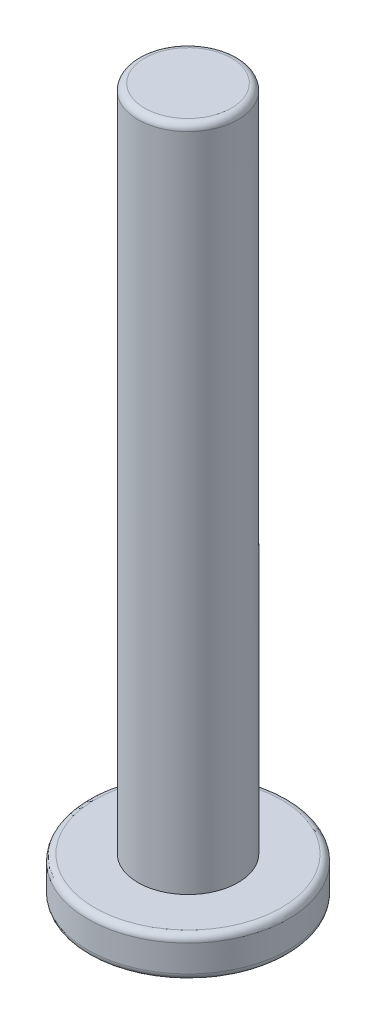
ISO-10303-21;
HEADER;
FILE_DESCRIPTION(('STEP AP214'),'2;1');
FILE_NAME('part.step','',(''),(''),'','','');
FILE_SCHEMA(('AUTOMOTIVE_DESIGN { 1 0 10303 214 1 1 1 1 }'));
ENDSEC;
DATA;
#1=APPLICATION_CONTEXT('core data for automotive mechanical design processes');
#2=APPLICATION_PROTOCOL_DEFINITION('international standard','automotive_design',2000,#1);
#3=PRODUCT_CONTEXT('',#1,'mechanical');
#4=PRODUCT('Part','Part','',(#3));
#5=PRODUCT_RELATED_PRODUCT_CATEGORY('part','',(#4));
#6=PRODUCT_DEFINITION_FORMATION('','',#4);
#7=PRODUCT_DEFINITION_CONTEXT('part definition',#1,'design');
#8=PRODUCT_DEFINITION('design','',#6,#7);
#9=PRODUCT_DEFINITION_SHAPE('','',#8);
#10=(LENGTH_UNIT() NAMED_UNIT(*) SI_UNIT(.MILLI.,.METRE.));
#11=(NAMED_UNIT(*) PLANE_ANGLE_UNIT() SI_UNIT($,.RADIAN.));
#12=(NAMED_UNIT(*) SI_UNIT($,.STERADIAN.) SOLID_ANGLE_UNIT());
#13=UNCERTAINTY_MEASURE_WITH_UNIT(LENGTH_MEASURE(1.E-05),#10,'distance_accuracy_value','');
#14=(GEOMETRIC_REPRESENTATION_CONTEXT(3) GLOBAL_UNCERTAINTY_ASSIGNED_CONTEXT((#13)) GLOBAL_UNIT_ASSIGNED_CONTEXT((#10,
#11,#12)) REPRESENTATION_CONTEXT('',''));
#15=CARTESIAN_POINT('',(0.,0.,0.));
#16=DIRECTION('',(0.,0.,1.));
#17=DIRECTION('',(1.,0.,0.));
#18=AXIS2_PLACEMENT_3D('',#15,#16,#17);
#19=CARTESIAN_POINT('',(0.,0.,0.));
#20=DIRECTION('',(0.,1.,0.));
#21=DIRECTION('',(0.,0.,1.));
#22=AXIS2_PLACEMENT_3D('',#19,#20,#21);
#23=PLANE('',#22);
#24=DIRECTION('',(-0.5,0.,0.866025403784439));
#25=VECTOR('',#24,1.);
#26=CARTESIAN_POINT('',(1.44337567297406,0.,0.));
#27=LINE('',#26,#25);
#28=CARTESIAN_POINT('',(1.44337567297406,0.,0.));
#29=VERTEX_POINT('',#28);
#30=CARTESIAN_POINT('',(0.721687836487032,0.,1.25));
#31=VERTEX_POINT('',#30);
#32=EDGE_CURVE('E122',#29,#31,#27,.T.);
#33=ORIENTED_EDGE('',*,*,#32,.F.);
#34=DIRECTION('',(0.5,0.,0.866025403784439));
#35=VECTOR('',#34,1.);
#36=CARTESIAN_POINT('',(0.721687836487032,0.,-1.25));
#37=LINE('',#36,#35);
#38=CARTESIAN_POINT('',(0.721687836487032,0.,-1.25));
#39=VERTEX_POINT('',#38);
#40=EDGE_CURVE('E48',#39,#29,#37,.T.);
#41=ORIENTED_EDGE('',*,*,#40,.F.);
#42=DIRECTION('',(1.,0.,0.));
#43=VECTOR('',#42,1.);
#44=CARTESIAN_POINT('',(-0.721687836487032,0.,-1.25));
#45=LINE('',#44,#43);
#46=CARTESIAN_POINT('',(-0.721687836487032,0.,-1.25));
#47=VERTEX_POINT('',#46);
#48=EDGE_CURVE('E131',#47,#39,#45,.T.);
#49=ORIENTED_EDGE('',*,*,#48,.F.);
#50=DIRECTION('',(0.5,0.,-0.866025403784439));
#51=VECTOR('',#50,1.);
#52=CARTESIAN_POINT('',(-1.44337567297407,0.,0.));
#53=LINE('',#52,#51);
#54=CARTESIAN_POINT('',(-1.44337567297407,0.,0.));
#55=VERTEX_POINT('',#54);
#56=EDGE_CURVE('E129',#55,#47,#53,.T.);
#57=ORIENTED_EDGE('',*,*,#56,.F.);
#58=DIRECTION('',(-0.5,0.,-0.866025403784439));
#59=VECTOR('',#58,1.);
#60=CARTESIAN_POINT('',(-0.721687836487033,0.,1.25));
#61=LINE('',#60,#59);
#62=CARTESIAN_POINT('',(-0.721687836487033,0.,1.25));
#63=VERTEX_POINT('',#62);
#64=EDGE_CURVE('E96',#63,#55,#61,.T.);
#65=ORIENTED_EDGE('',*,*,#64,.F.);
#66=DIRECTION('',(-1.,0.,0.));
#67=VECTOR('',#66,1.);
#68=CARTESIAN_POINT('',(0.721687836487032,0.,1.25));
#69=LINE('',#68,#67);
#70=EDGE_CURVE('E125',#31,#63,#69,.T.);
#71=ORIENTED_EDGE('',*,*,#70,.F.);
#72=EDGE_LOOP('',(#33,#41,#49,#57,#65,#71));
#73=FACE_BOUND('',#72,.T.);
#74=CARTESIAN_POINT('',(0.,0.,0.));
#75=DIRECTION('',(0.,1.,0.));
#76=DIRECTION('',(0.,0.,1.));
#77=AXIS2_PLACEMENT_3D('',#74,#75,#76);
#78=CIRCLE('',#77,2.8);
#79=CARTESIAN_POINT('',(0.,0.,2.8));
#80=VERTEX_POINT('',#79);
#81=EDGE_CURVE('E11',#80,#80,#78,.F.);
#82=ORIENTED_EDGE('',*,*,#81,.T.);
#83=EDGE_LOOP('',(#82));
#84=FACE_BOUND('',#83,.T.);
#85=ADVANCED_FACE('F33',(#73,#84),#23,.F.);
#86=CARTESIAN_POINT('',(0.,73.1142663620776,0.));
#87=DIRECTION('',(0.,1.,0.));
#88=DIRECTION('',(0.,0.,1.));
#89=AXIS2_PLACEMENT_3D('',#86,#87,#88);
#90=CYLINDRICAL_SURFACE('',#89,3.);
#91=CARTESIAN_POINT('',(0.,1.,0.));
#92=DIRECTION('',(0.,-1.,0.));
#93=DIRECTION('',(0.,0.,-1.));
#94=AXIS2_PLACEMENT_3D('',#91,#92,#93);
#95=CIRCLE('',#94,3.);
#96=CARTESIAN_POINT('',(0.,1.,-3.));
#97=VERTEX_POINT('',#96);
#98=EDGE_CURVE('E149',#97,#97,#95,.T.);
#99=ORIENTED_EDGE('',*,*,#98,.T.);
#100=EDGE_LOOP('',(#99));
#101=FACE_BOUND('',#100,.T.);
#102=CARTESIAN_POINT('',(0.,0.200000000000006,0.));
#103=DIRECTION('',(0.,1.,0.));
#104=DIRECTION('',(0.,0.,1.));
#105=AXIS2_PLACEMENT_3D('',#102,#103,#104);
#106=CIRCLE('',#105,3.);
#107=CARTESIAN_POINT('',(0.,0.200000000000006,3.));
#108=VERTEX_POINT('',#107);
#109=EDGE_CURVE('E146',#108,#108,#106,.T.);
#110=ORIENTED_EDGE('',*,*,#109,.T.);
#111=EDGE_LOOP('',(#110));
#112=FACE_BOUND('',#111,.T.);
#113=ADVANCED_FACE('F179',(#101,#112),#90,.T.);
#114=CARTESIAN_POINT('',(3.,1.2,0.));
#115=DIRECTION('',(0.,-1.,0.));
#116=DIRECTION('',(0.,0.,-1.));
#117=AXIS2_PLACEMENT_3D('',#114,#115,#116);
#118=PLANE('',#117);
#119=CARTESIAN_POINT('',(0.,1.2,0.));
#120=DIRECTION('',(0.,-1.,0.));
#121=DIRECTION('',(0.,0.,-1.));
#122=AXIS2_PLACEMENT_3D('',#119,#120,#121);
#123=CIRCLE('',#122,2.8);
#124=CARTESIAN_POINT('',(0.,1.2,-2.8));
#125=VERTEX_POINT('',#124);
#126=EDGE_CURVE('E143',#125,#125,#123,.F.);
#127=ORIENTED_EDGE('',*,*,#126,.T.);
#128=EDGE_LOOP('',(#127));
#129=FACE_BOUND('',#128,.T.);
#130=CARTESIAN_POINT('',(0.,1.19999999999999,0.));
#131=DIRECTION('',(0.,1.,0.));
#132=DIRECTION('',(0.,0.,1.));
#133=AXIS2_PLACEMENT_3D('',#130,#131,#132);
#134=CIRCLE('',#133,1.5);
#135=CARTESIAN_POINT('',(0.,1.19999999999999,1.5));
#136=VERTEX_POINT('',#135);
#137=EDGE_CURVE('E135',#136,#136,#134,.T.);
#138=ORIENTED_EDGE('',*,*,#137,.F.);
#139=EDGE_LOOP('',(#138));
#140=FACE_BOUND('',#139,.T.);
#141=ADVANCED_FACE('F175',(#129,#140),#118,.F.);
#142=CARTESIAN_POINT('',(0.,73.1142663620776,0.));
#143=DIRECTION('',(0.,1.,0.));
#144=DIRECTION('',(0.,0.,1.));
#145=AXIS2_PLACEMENT_3D('',#142,#143,#144);
#146=CYLINDRICAL_SURFACE('',#145,1.5);
#147=CARTESIAN_POINT('',(0.,21.,0.));
#148=DIRECTION('',(0.,-1.,0.));
#149=DIRECTION('',(0.,0.,-1.));
#150=AXIS2_PLACEMENT_3D('',#147,#148,#149);
#151=CIRCLE('',#150,1.5);
#152=CARTESIAN_POINT('',(0.,21.,-1.5));
#153=VERTEX_POINT('',#152);
#154=EDGE_CURVE('E41',#153,#153,#151,.T.);
#155=ORIENTED_EDGE('',*,*,#154,.T.);
#156=EDGE_LOOP('',(#155));
#157=FACE_BOUND('',#156,.T.);
#158=ORIENTED_EDGE('',*,*,#137,.T.);
#159=EDGE_LOOP('',(#158));
#160=FACE_BOUND('',#159,.T.);
#161=ADVANCED_FACE('F157',(#157,#160),#146,.T.);
#162=CARTESIAN_POINT('',(1.5,21.2,0.));
#163=DIRECTION('',(0.,-1.,0.));
#164=DIRECTION('',(0.,0.,-1.));
#165=AXIS2_PLACEMENT_3D('',#162,#163,#164);
#166=PLANE('',#165);
#167=CARTESIAN_POINT('',(0.,21.2,0.));
#168=DIRECTION('',(0.,-1.,0.));
#169=DIRECTION('',(0.,0.,-1.));
#170=AXIS2_PLACEMENT_3D('',#167,#168,#169);
#171=CIRCLE('',#170,1.3);
#172=CARTESIAN_POINT('',(0.,21.2,-1.3));
#173=VERTEX_POINT('',#172);
#174=EDGE_CURVE('E152',#173,#173,#171,.F.);
#175=ORIENTED_EDGE('',*,*,#174,.T.);
#176=EDGE_LOOP('',(#175));
#177=FACE_BOUND('',#176,.T.);
#178=ADVANCED_FACE('F166',(#177),#166,.F.);
#179=CARTESIAN_POINT('',(0.,1.,0.));
#180=DIRECTION('',(0.,-1.,0.));
#181=DIRECTION('',(0.,0.,-1.));
#182=AXIS2_PLACEMENT_3D('',#179,#180,#181);
#183=TOROIDAL_SURFACE('',#182,2.8,0.2);
#184=ORIENTED_EDGE('',*,*,#98,.F.);
#185=EDGE_LOOP('',(#184));
#186=FACE_BOUND('',#185,.T.);
#187=ORIENTED_EDGE('',*,*,#126,.F.);
#188=EDGE_LOOP('',(#187));
#189=FACE_BOUND('',#188,.T.);
#190=ADVANCED_FACE('F163',(#186,#189),#183,.T.);
#191=CARTESIAN_POINT('',(0.,21.,0.));
#192=DIRECTION('',(0.,-1.,0.));
#193=DIRECTION('',(0.,0.,-1.));
#194=AXIS2_PLACEMENT_3D('',#191,#192,#193);
#195=TOROIDAL_SURFACE('',#194,1.3,0.2);
#196=ORIENTED_EDGE('',*,*,#154,.F.);
#197=EDGE_LOOP('',(#196));
#198=FACE_BOUND('',#197,.T.);
#199=ORIENTED_EDGE('',*,*,#174,.F.);
#200=EDGE_LOOP('',(#199));
#201=FACE_BOUND('',#200,.T.);
#202=ADVANCED_FACE('F160',(#198,#201),#195,.T.);
#203=CARTESIAN_POINT('',(0.,0.200000000000006,0.));
#204=DIRECTION('',(0.,1.,0.));
#205=DIRECTION('',(0.,0.,1.));
#206=AXIS2_PLACEMENT_3D('',#203,#204,#205);
#207=TOROIDAL_SURFACE('',#206,2.8,0.2);
#208=ORIENTED_EDGE('',*,*,#81,.F.);
#209=EDGE_LOOP('',(#208));
#210=FACE_BOUND('',#209,.T.);
#211=ORIENTED_EDGE('',*,*,#109,.F.);
#212=EDGE_LOOP('',(#211));
#213=FACE_BOUND('',#212,.T.);
#214=ADVANCED_FACE('F35',(#210,#213),#207,.T.);
#215=CARTESIAN_POINT('',(0.721687836487032,1.,-1.25));
#216=DIRECTION('',(0.866025403784439,0.,-0.5));
#217=DIRECTION('',(-0.5,0.,-0.866025403784439));
#218=AXIS2_PLACEMENT_3D('',#215,#216,#217);
#219=PLANE('',#218);
#220=ORIENTED_EDGE('',*,*,#40,.T.);
#221=DIRECTION('',(0.,-1.,0.));
#222=VECTOR('',#221,1.);
#223=CARTESIAN_POINT('',(1.44337567297406,1.,0.));
#224=LINE('',#223,#222);
#225=CARTESIAN_POINT('',(1.44337567297406,1.,0.));
#226=VERTEX_POINT('',#225);
#227=EDGE_CURVE('E78',#226,#29,#224,.T.);
#228=ORIENTED_EDGE('',*,*,#227,.F.);
#229=DIRECTION('',(0.5,0.,0.866025403784439));
#230=VECTOR('',#229,1.);
#231=CARTESIAN_POINT('',(0.721687836487032,1.,-1.25));
#232=LINE('',#231,#230);
#233=CARTESIAN_POINT('',(0.721687836487032,1.,-1.25));
#234=VERTEX_POINT('',#233);
#235=EDGE_CURVE('E133',#234,#226,#232,.T.);
#236=ORIENTED_EDGE('',*,*,#235,.F.);
#237=DIRECTION('',(0.,-1.,0.));
#238=VECTOR('',#237,1.);
#239=CARTESIAN_POINT('',(0.721687836487032,1.,-1.25));
#240=LINE('',#239,#238);
#241=EDGE_CURVE('E56',#234,#39,#240,.T.);
#242=ORIENTED_EDGE('',*,*,#241,.T.);
#243=EDGE_LOOP('',(#220,#228,#236,#242));
#244=FACE_BOUND('',#243,.T.);
#245=ADVANCED_FACE('F228',(#244),#219,.F.);
#246=CARTESIAN_POINT('',(-0.721687836487032,1.,-1.25));
#247=DIRECTION('',(0.,0.,-1.));
#248=DIRECTION('',(-1.,0.,0.));
#249=AXIS2_PLACEMENT_3D('',#246,#247,#248);
#250=PLANE('',#249);
#251=ORIENTED_EDGE('',*,*,#48,.T.);
#252=ORIENTED_EDGE('',*,*,#241,.F.);
#253=DIRECTION('',(1.,0.,0.));
#254=VECTOR('',#253,1.);
#255=CARTESIAN_POINT('',(-0.721687836487032,1.,-1.25));
#256=LINE('',#255,#254);
#257=CARTESIAN_POINT('',(-0.721687836487032,1.,-1.25));
#258=VERTEX_POINT('',#257);
#259=EDGE_CURVE('E108',#258,#234,#256,.T.);
#260=ORIENTED_EDGE('',*,*,#259,.F.);
#261=DIRECTION('',(0.,-1.,0.));
#262=VECTOR('',#261,1.);
#263=CARTESIAN_POINT('',(-0.721687836487032,1.,-1.25));
#264=LINE('',#263,#262);
#265=EDGE_CURVE('E100',#258,#47,#264,.T.);
#266=ORIENTED_EDGE('',*,*,#265,.T.);
#267=EDGE_LOOP('',(#251,#252,#260,#266));
#268=FACE_BOUND('',#267,.T.);
#269=ADVANCED_FACE('F243',(#268),#250,.F.);
#270=CARTESIAN_POINT('',(-1.44337567297407,1.,0.));
#271=DIRECTION('',(-0.866025403784439,0.,-0.5));
#272=DIRECTION('',(-0.5,0.,0.866025403784439));
#273=AXIS2_PLACEMENT_3D('',#270,#271,#272);
#274=PLANE('',#273);
#275=ORIENTED_EDGE('',*,*,#56,.T.);
#276=ORIENTED_EDGE('',*,*,#265,.F.);
#277=DIRECTION('',(0.5,0.,-0.866025403784439));
#278=VECTOR('',#277,1.);
#279=CARTESIAN_POINT('',(-1.44337567297407,1.,0.));
#280=LINE('',#279,#278);
#281=CARTESIAN_POINT('',(-1.44337567297407,1.,0.));
#282=VERTEX_POINT('',#281);
#283=EDGE_CURVE('E104',#282,#258,#280,.T.);
#284=ORIENTED_EDGE('',*,*,#283,.F.);
#285=DIRECTION('',(0.,-1.,0.));
#286=VECTOR('',#285,1.);
#287=CARTESIAN_POINT('',(-1.44337567297407,1.,0.));
#288=LINE('',#287,#286);
#289=EDGE_CURVE('E89',#282,#55,#288,.T.);
#290=ORIENTED_EDGE('',*,*,#289,.T.);
#291=EDGE_LOOP('',(#275,#276,#284,#290));
#292=FACE_BOUND('',#291,.T.);
#293=ADVANCED_FACE('F105',(#292),#274,.F.);
#294=CARTESIAN_POINT('',(-0.721687836487033,1.,1.25));
#295=DIRECTION('',(-0.866025403784439,0.,0.5));
#296=DIRECTION('',(0.5,0.,0.866025403784439));
#297=AXIS2_PLACEMENT_3D('',#294,#295,#296);
#298=PLANE('',#297);
#299=ORIENTED_EDGE('',*,*,#64,.T.);
#300=ORIENTED_EDGE('',*,*,#289,.F.);
#301=DIRECTION('',(-0.5,0.,-0.866025403784439));
#302=VECTOR('',#301,1.);
#303=CARTESIAN_POINT('',(-0.721687836487033,1.,1.25));
#304=LINE('',#303,#302);
#305=CARTESIAN_POINT('',(-0.721687836487033,1.,1.25));
#306=VERTEX_POINT('',#305);
#307=EDGE_CURVE('E93',#306,#282,#304,.T.);
#308=ORIENTED_EDGE('',*,*,#307,.F.);
#309=DIRECTION('',(0.,-1.,0.));
#310=VECTOR('',#309,1.);
#311=CARTESIAN_POINT('',(-0.721687836487033,1.,1.25));
#312=LINE('',#311,#310);
#313=EDGE_CURVE('E101',#306,#63,#312,.T.);
#314=ORIENTED_EDGE('',*,*,#313,.T.);
#315=EDGE_LOOP('',(#299,#300,#308,#314));
#316=FACE_BOUND('',#315,.T.);
#317=ADVANCED_FACE('F91',(#316),#298,.F.);
#318=CARTESIAN_POINT('',(0.721687836487032,1.,1.25));
#319=DIRECTION('',(0.,0.,1.));
#320=DIRECTION('',(1.,0.,0.));
#321=AXIS2_PLACEMENT_3D('',#318,#319,#320);
#322=PLANE('',#321);
#323=ORIENTED_EDGE('',*,*,#70,.T.);
#324=ORIENTED_EDGE('',*,*,#313,.F.);
#325=DIRECTION('',(-1.,0.,0.));
#326=VECTOR('',#325,1.);
#327=CARTESIAN_POINT('',(0.721687836487032,1.,1.25));
#328=LINE('',#327,#326);
#329=CARTESIAN_POINT('',(0.721687836487032,1.,1.25));
#330=VERTEX_POINT('',#329);
#331=EDGE_CURVE('E114',#330,#306,#328,.T.);
#332=ORIENTED_EDGE('',*,*,#331,.F.);
#333=DIRECTION('',(0.,-1.,0.));
#334=VECTOR('',#333,1.);
#335=CARTESIAN_POINT('',(0.721687836487032,1.,1.25));
#336=LINE('',#335,#334);
#337=EDGE_CURVE('E138',#330,#31,#336,.T.);
#338=ORIENTED_EDGE('',*,*,#337,.T.);
#339=EDGE_LOOP('',(#323,#324,#332,#338));
#340=FACE_BOUND('',#339,.T.);
#341=ADVANCED_FACE('F267',(#340),#322,.F.);
#342=CARTESIAN_POINT('',(1.44337567297406,1.,0.));
#343=DIRECTION('',(0.866025403784439,0.,0.5));
#344=DIRECTION('',(0.5,0.,-0.866025403784439));
#345=AXIS2_PLACEMENT_3D('',#342,#343,#344);
#346=PLANE('',#345);
#347=ORIENTED_EDGE('',*,*,#32,.T.);
#348=ORIENTED_EDGE('',*,*,#337,.F.);
#349=DIRECTION('',(-0.5,0.,0.866025403784439));
#350=VECTOR('',#349,1.);
#351=CARTESIAN_POINT('',(1.44337567297406,1.,0.));
#352=LINE('',#351,#350);
#353=EDGE_CURVE('E116',#226,#330,#352,.T.);
#354=ORIENTED_EDGE('',*,*,#353,.F.);
#355=ORIENTED_EDGE('',*,*,#227,.T.);
#356=EDGE_LOOP('',(#347,#348,#354,#355));
#357=FACE_BOUND('',#356,.T.);
#358=ADVANCED_FACE('F276',(#357),#346,.F.);
#359=CARTESIAN_POINT('',(0.,1.,0.));
#360=DIRECTION('',(0.,-1.,0.));
#361=DIRECTION('',(0.,0.,-1.));
#362=AXIS2_PLACEMENT_3D('',#359,#360,#361);
#363=PLANE('',#362);
#364=ORIENTED_EDGE('',*,*,#235,.T.);
#365=ORIENTED_EDGE('',*,*,#353,.T.);
#366=ORIENTED_EDGE('',*,*,#331,.T.);
#367=ORIENTED_EDGE('',*,*,#307,.T.);
#368=ORIENTED_EDGE('',*,*,#283,.T.);
#369=ORIENTED_EDGE('',*,*,#259,.T.);
#370=EDGE_LOOP('',(#364,#365,#366,#367,#368,#369));
#371=FACE_BOUND('',#370,.T.);
#372=ADVANCED_FACE('F111',(#371),#363,.T.);
#373=CLOSED_SHELL('',(#85,#113,#141,#161,#178,#190,#202,#214,#245,#269,#293,#317,#341,#358,#372));
#374=MANIFOLD_SOLID_BREP('B2',#373);
#375=ADVANCED_BREP_SHAPE_REPRESENTATION('',(#18,#374),#14);
#376=SHAPE_DEFINITION_REPRESENTATION(#9,#375);
ENDSEC;
END-ISO-10303-21;
